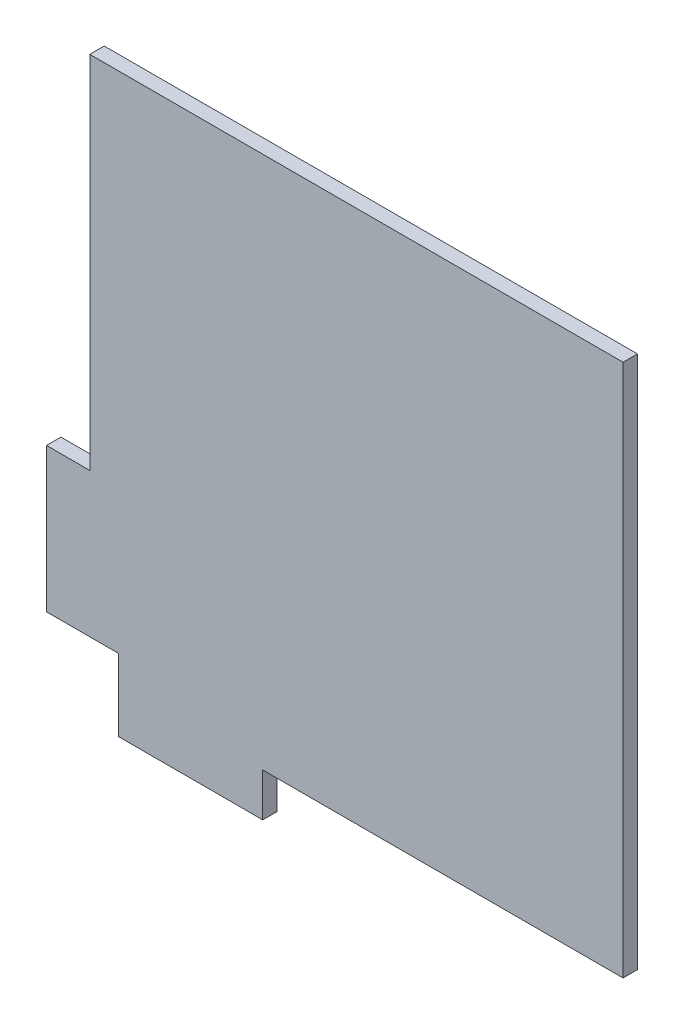
ISO-10303-21;
HEADER;
FILE_DESCRIPTION(('STEP AP214'),'2;1');
FILE_NAME('part.step','',(''),(''),'','','');
FILE_SCHEMA(('AUTOMOTIVE_DESIGN { 1 0 10303 214 1 1 1 1 }'));
ENDSEC;
DATA;
#1=APPLICATION_CONTEXT('core data for automotive mechanical design processes');
#2=APPLICATION_PROTOCOL_DEFINITION('international standard','automotive_design',2000,#1);
#3=PRODUCT_CONTEXT('',#1,'mechanical');
#4=PRODUCT('Part','Part','',(#3));
#5=PRODUCT_RELATED_PRODUCT_CATEGORY('part','',(#4));
#6=PRODUCT_DEFINITION_FORMATION('','',#4);
#7=PRODUCT_DEFINITION_CONTEXT('part definition',#1,'design');
#8=PRODUCT_DEFINITION('design','',#6,#7);
#9=PRODUCT_DEFINITION_SHAPE('','',#8);
#10=(LENGTH_UNIT() NAMED_UNIT(*) SI_UNIT(.MILLI.,.METRE.));
#11=(NAMED_UNIT(*) PLANE_ANGLE_UNIT() SI_UNIT($,.RADIAN.));
#12=(NAMED_UNIT(*) SI_UNIT($,.STERADIAN.) SOLID_ANGLE_UNIT());
#13=UNCERTAINTY_MEASURE_WITH_UNIT(LENGTH_MEASURE(1.E-05),#10,'distance_accuracy_value','');
#14=(GEOMETRIC_REPRESENTATION_CONTEXT(3) GLOBAL_UNCERTAINTY_ASSIGNED_CONTEXT((#13)) GLOBAL_UNIT_ASSIGNED_CONTEXT((#10,
#11,#12)) REPRESENTATION_CONTEXT('',''));
#15=CARTESIAN_POINT('',(0.,0.,0.));
#16=DIRECTION('',(0.,0.,1.));
#17=DIRECTION('',(1.,0.,0.));
#18=AXIS2_PLACEMENT_3D('',#15,#16,#17);
#19=CARTESIAN_POINT('',(0.,3.7,0.05));
#20=DIRECTION('',(0.,-1.,0.));
#21=DIRECTION('',(1.,0.,0.));
#22=AXIS2_PLACEMENT_3D('',#19,#20,#21);
#23=PLANE('',#22);
#24=DIRECTION('',(-1.,0.,0.));
#25=VECTOR('',#24,1.);
#26=CARTESIAN_POINT('',(0.,3.7,-0.05));
#27=LINE('',#26,#25);
#28=CARTESIAN_POINT('',(0.,3.7,-0.05));
#29=VERTEX_POINT('',#28);
#30=CARTESIAN_POINT('',(-3.7,3.7,-0.05));
#31=VERTEX_POINT('',#30);
#32=EDGE_CURVE('E152',#29,#31,#27,.T.);
#33=ORIENTED_EDGE('',*,*,#32,.T.);
#34=DIRECTION('',(0.,0.,-1.));
#35=VECTOR('',#34,1.);
#36=CARTESIAN_POINT('',(-3.7,3.7,0.05));
#37=LINE('',#36,#35);
#38=CARTESIAN_POINT('',(-3.7,3.7,0.05));
#39=VERTEX_POINT('',#38);
#40=EDGE_CURVE('E11',#39,#31,#37,.T.);
#41=ORIENTED_EDGE('',*,*,#40,.F.);
#42=DIRECTION('',(-1.,0.,0.));
#43=VECTOR('',#42,1.);
#44=CARTESIAN_POINT('',(0.,3.7,0.05));
#45=LINE('',#44,#43);
#46=CARTESIAN_POINT('',(0.,3.7,0.05));
#47=VERTEX_POINT('',#46);
#48=EDGE_CURVE('E180',#47,#39,#45,.T.);
#49=ORIENTED_EDGE('',*,*,#48,.F.);
#50=DIRECTION('',(0.,0.,-1.));
#51=VECTOR('',#50,1.);
#52=CARTESIAN_POINT('',(0.,3.7,0.05));
#53=LINE('',#52,#51);
#54=EDGE_CURVE('E148',#47,#29,#53,.T.);
#55=ORIENTED_EDGE('',*,*,#54,.T.);
#56=EDGE_LOOP('',(#33,#41,#49,#55));
#57=FACE_BOUND('',#56,.T.);
#58=ADVANCED_FACE('F39',(#57),#23,.F.);
#59=CARTESIAN_POINT('',(-3.7,1.2,0.05));
#60=DIRECTION('',(1.,0.,0.));
#61=DIRECTION('',(0.,0.,-1.));
#62=AXIS2_PLACEMENT_3D('',#59,#60,#61);
#63=PLANE('',#62);
#64=DIRECTION('',(0.,-1.,0.));
#65=VECTOR('',#64,1.);
#66=CARTESIAN_POINT('',(-3.7,1.2,-0.05));
#67=LINE('',#66,#65);
#68=CARTESIAN_POINT('',(-3.7,1.2,-0.05));
#69=VERTEX_POINT('',#68);
#70=EDGE_CURVE('E156',#31,#69,#67,.T.);
#71=ORIENTED_EDGE('',*,*,#70,.T.);
#72=DIRECTION('',(0.,0.,-1.));
#73=VECTOR('',#72,1.);
#74=CARTESIAN_POINT('',(-3.7,1.2,0.05));
#75=LINE('',#74,#73);
#76=CARTESIAN_POINT('',(-3.7,1.2,0.05));
#77=VERTEX_POINT('',#76);
#78=EDGE_CURVE('E48',#77,#69,#75,.T.);
#79=ORIENTED_EDGE('',*,*,#78,.F.);
#80=DIRECTION('',(0.,-1.,0.));
#81=VECTOR('',#80,1.);
#82=CARTESIAN_POINT('',(-3.7,1.2,0.05));
#83=LINE('',#82,#81);
#84=EDGE_CURVE('E105',#39,#77,#83,.T.);
#85=ORIENTED_EDGE('',*,*,#84,.F.);
#86=ORIENTED_EDGE('',*,*,#40,.T.);
#87=EDGE_LOOP('',(#71,#79,#85,#86));
#88=FACE_BOUND('',#87,.T.);
#89=ADVANCED_FACE('F244',(#88),#63,.F.);
#90=CARTESIAN_POINT('',(-4.,1.2,0.05));
#91=DIRECTION('',(0.,-1.,0.));
#92=DIRECTION('',(1.,0.,0.));
#93=AXIS2_PLACEMENT_3D('',#90,#91,#92);
#94=PLANE('',#93);
#95=DIRECTION('',(-1.,0.,0.));
#96=VECTOR('',#95,1.);
#97=CARTESIAN_POINT('',(-4.,1.2,-0.05));
#98=LINE('',#97,#96);
#99=CARTESIAN_POINT('',(-4.,1.2,-0.05));
#100=VERTEX_POINT('',#99);
#101=EDGE_CURVE('E159',#69,#100,#98,.T.);
#102=ORIENTED_EDGE('',*,*,#101,.T.);
#103=DIRECTION('',(0.,0.,-1.));
#104=VECTOR('',#103,1.);
#105=CARTESIAN_POINT('',(-4.,1.2,0.05));
#106=LINE('',#105,#104);
#107=CARTESIAN_POINT('',(-4.,1.2,0.05));
#108=VERTEX_POINT('',#107);
#109=EDGE_CURVE('E199',#108,#100,#106,.T.);
#110=ORIENTED_EDGE('',*,*,#109,.F.);
#111=DIRECTION('',(-1.,0.,0.));
#112=VECTOR('',#111,1.);
#113=CARTESIAN_POINT('',(-4.,1.2,0.05));
#114=LINE('',#113,#112);
#115=EDGE_CURVE('E209',#77,#108,#114,.T.);
#116=ORIENTED_EDGE('',*,*,#115,.F.);
#117=ORIENTED_EDGE('',*,*,#78,.T.);
#118=EDGE_LOOP('',(#102,#110,#116,#117));
#119=FACE_BOUND('',#118,.T.);
#120=ADVANCED_FACE('F207',(#119),#94,.F.);
#121=CARTESIAN_POINT('',(-4.,0.2,0.05));
#122=DIRECTION('',(1.,0.,0.));
#123=DIRECTION('',(0.,0.,-1.));
#124=AXIS2_PLACEMENT_3D('',#121,#122,#123);
#125=PLANE('',#124);
#126=DIRECTION('',(0.,-1.,0.));
#127=VECTOR('',#126,1.);
#128=CARTESIAN_POINT('',(-4.,0.2,-0.05));
#129=LINE('',#128,#127);
#130=CARTESIAN_POINT('',(-4.,0.2,-0.05));
#131=VERTEX_POINT('',#130);
#132=EDGE_CURVE('E162',#100,#131,#129,.T.);
#133=ORIENTED_EDGE('',*,*,#132,.T.);
#134=DIRECTION('',(0.,0.,-1.));
#135=VECTOR('',#134,1.);
#136=CARTESIAN_POINT('',(-4.,0.2,0.05));
#137=LINE('',#136,#135);
#138=CARTESIAN_POINT('',(-4.,0.2,0.05));
#139=VERTEX_POINT('',#138);
#140=EDGE_CURVE('E195',#139,#131,#137,.T.);
#141=ORIENTED_EDGE('',*,*,#140,.F.);
#142=DIRECTION('',(0.,-1.,0.));
#143=VECTOR('',#142,1.);
#144=CARTESIAN_POINT('',(-4.,0.2,0.05));
#145=LINE('',#144,#143);
#146=EDGE_CURVE('E228',#108,#139,#145,.T.);
#147=ORIENTED_EDGE('',*,*,#146,.F.);
#148=ORIENTED_EDGE('',*,*,#109,.T.);
#149=EDGE_LOOP('',(#133,#141,#147,#148));
#150=FACE_BOUND('',#149,.T.);
#151=ADVANCED_FACE('F218',(#150),#125,.F.);
#152=CARTESIAN_POINT('',(-3.5,0.2,0.05));
#153=DIRECTION('',(0.,1.,0.));
#154=DIRECTION('',(-1.,0.,0.));
#155=AXIS2_PLACEMENT_3D('',#152,#153,#154);
#156=PLANE('',#155);
#157=DIRECTION('',(1.,0.,0.));
#158=VECTOR('',#157,1.);
#159=CARTESIAN_POINT('',(-3.5,0.2,-0.05));
#160=LINE('',#159,#158);
#161=CARTESIAN_POINT('',(-3.5,0.2,-0.05));
#162=VERTEX_POINT('',#161);
#163=EDGE_CURVE('E165',#131,#162,#160,.T.);
#164=ORIENTED_EDGE('',*,*,#163,.T.);
#165=DIRECTION('',(0.,0.,-1.));
#166=VECTOR('',#165,1.);
#167=CARTESIAN_POINT('',(-3.5,0.2,0.05));
#168=LINE('',#167,#166);
#169=CARTESIAN_POINT('',(-3.5,0.2,0.05));
#170=VERTEX_POINT('',#169);
#171=EDGE_CURVE('E191',#170,#162,#168,.T.);
#172=ORIENTED_EDGE('',*,*,#171,.F.);
#173=DIRECTION('',(1.,0.,0.));
#174=VECTOR('',#173,1.);
#175=CARTESIAN_POINT('',(-3.5,0.2,0.05));
#176=LINE('',#175,#174);
#177=EDGE_CURVE('E224',#139,#170,#176,.T.);
#178=ORIENTED_EDGE('',*,*,#177,.F.);
#179=ORIENTED_EDGE('',*,*,#140,.T.);
#180=EDGE_LOOP('',(#164,#172,#178,#179));
#181=FACE_BOUND('',#180,.T.);
#182=ADVANCED_FACE('F222',(#181),#156,.F.);
#183=CARTESIAN_POINT('',(-3.5,-0.3,0.05));
#184=DIRECTION('',(1.,0.,0.));
#185=DIRECTION('',(0.,0.,-1.));
#186=AXIS2_PLACEMENT_3D('',#183,#184,#185);
#187=PLANE('',#186);
#188=DIRECTION('',(0.,-1.,0.));
#189=VECTOR('',#188,1.);
#190=CARTESIAN_POINT('',(-3.5,-0.3,-0.05));
#191=LINE('',#190,#189);
#192=CARTESIAN_POINT('',(-3.5,-0.3,-0.05));
#193=VERTEX_POINT('',#192);
#194=EDGE_CURVE('E168',#162,#193,#191,.T.);
#195=ORIENTED_EDGE('',*,*,#194,.T.);
#196=DIRECTION('',(0.,0.,-1.));
#197=VECTOR('',#196,1.);
#198=CARTESIAN_POINT('',(-3.5,-0.3,0.05));
#199=LINE('',#198,#197);
#200=CARTESIAN_POINT('',(-3.5,-0.3,0.05));
#201=VERTEX_POINT('',#200);
#202=EDGE_CURVE('E187',#201,#193,#199,.T.);
#203=ORIENTED_EDGE('',*,*,#202,.F.);
#204=DIRECTION('',(0.,-1.,0.));
#205=VECTOR('',#204,1.);
#206=CARTESIAN_POINT('',(-3.5,-0.3,0.05));
#207=LINE('',#206,#205);
#208=EDGE_CURVE('E227',#170,#201,#207,.T.);
#209=ORIENTED_EDGE('',*,*,#208,.F.);
#210=ORIENTED_EDGE('',*,*,#171,.T.);
#211=EDGE_LOOP('',(#195,#203,#209,#210));
#212=FACE_BOUND('',#211,.T.);
#213=ADVANCED_FACE('F256',(#212),#187,.F.);
#214=CARTESIAN_POINT('',(-2.5,-0.3,0.05));
#215=DIRECTION('',(0.,1.,0.));
#216=DIRECTION('',(-1.,0.,0.));
#217=AXIS2_PLACEMENT_3D('',#214,#215,#216);
#218=PLANE('',#217);
#219=DIRECTION('',(1.,0.,0.));
#220=VECTOR('',#219,1.);
#221=CARTESIAN_POINT('',(-2.5,-0.3,-0.05));
#222=LINE('',#221,#220);
#223=CARTESIAN_POINT('',(-2.5,-0.3,-0.05));
#224=VERTEX_POINT('',#223);
#225=EDGE_CURVE('E171',#193,#224,#222,.T.);
#226=ORIENTED_EDGE('',*,*,#225,.T.);
#227=DIRECTION('',(0.,0.,-1.));
#228=VECTOR('',#227,1.);
#229=CARTESIAN_POINT('',(-2.5,-0.3,0.05));
#230=LINE('',#229,#228);
#231=CARTESIAN_POINT('',(-2.5,-0.3,0.05));
#232=VERTEX_POINT('',#231);
#233=EDGE_CURVE('E141',#232,#224,#230,.T.);
#234=ORIENTED_EDGE('',*,*,#233,.F.);
#235=DIRECTION('',(1.,0.,0.));
#236=VECTOR('',#235,1.);
#237=CARTESIAN_POINT('',(-2.5,-0.3,0.05));
#238=LINE('',#237,#236);
#239=EDGE_CURVE('E130',#201,#232,#238,.T.);
#240=ORIENTED_EDGE('',*,*,#239,.F.);
#241=ORIENTED_EDGE('',*,*,#202,.T.);
#242=EDGE_LOOP('',(#226,#234,#240,#241));
#243=FACE_BOUND('',#242,.T.);
#244=ADVANCED_FACE('F259',(#243),#218,.F.);
#245=CARTESIAN_POINT('',(-2.5,0.,0.05));
#246=DIRECTION('',(-1.,0.,0.));
#247=DIRECTION('',(0.,0.,1.));
#248=AXIS2_PLACEMENT_3D('',#245,#246,#247);
#249=PLANE('',#248);
#250=DIRECTION('',(0.,1.,0.));
#251=VECTOR('',#250,1.);
#252=CARTESIAN_POINT('',(-2.5,0.,-0.05));
#253=LINE('',#252,#251);
#254=CARTESIAN_POINT('',(-2.5,0.,-0.05));
#255=VERTEX_POINT('',#254);
#256=EDGE_CURVE('E139',#224,#255,#253,.T.);
#257=ORIENTED_EDGE('',*,*,#256,.T.);
#258=DIRECTION('',(0.,0.,-1.));
#259=VECTOR('',#258,1.);
#260=CARTESIAN_POINT('',(-2.5,0.,0.05));
#261=LINE('',#260,#259);
#262=CARTESIAN_POINT('',(-2.5,0.,0.05));
#263=VERTEX_POINT('',#262);
#264=EDGE_CURVE('E136',#263,#255,#261,.T.);
#265=ORIENTED_EDGE('',*,*,#264,.F.);
#266=DIRECTION('',(0.,1.,0.));
#267=VECTOR('',#266,1.);
#268=CARTESIAN_POINT('',(-2.5,0.,0.05));
#269=LINE('',#268,#267);
#270=EDGE_CURVE('E124',#232,#263,#269,.T.);
#271=ORIENTED_EDGE('',*,*,#270,.F.);
#272=ORIENTED_EDGE('',*,*,#233,.T.);
#273=EDGE_LOOP('',(#257,#265,#271,#272));
#274=FACE_BOUND('',#273,.T.);
#275=ADVANCED_FACE('F137',(#274),#249,.F.);
#276=CARTESIAN_POINT('',(-2.5,0.,0.05));
#277=DIRECTION('',(0.,1.,0.));
#278=DIRECTION('',(0.,0.,1.));
#279=AXIS2_PLACEMENT_3D('',#276,#277,#278);
#280=PLANE('',#279);
#281=DIRECTION('',(1.,0.,0.));
#282=VECTOR('',#281,1.);
#283=CARTESIAN_POINT('',(-2.5,0.,-0.05));
#284=LINE('',#283,#282);
#285=CARTESIAN_POINT('',(0.,0.,-0.05));
#286=VERTEX_POINT('',#285);
#287=EDGE_CURVE('E91',#255,#286,#284,.T.);
#288=ORIENTED_EDGE('',*,*,#287,.T.);
#289=DIRECTION('',(0.,0.,-1.));
#290=VECTOR('',#289,1.);
#291=CARTESIAN_POINT('',(0.,0.,0.05));
#292=LINE('',#291,#290);
#293=CARTESIAN_POINT('',(0.,0.,0.05));
#294=VERTEX_POINT('',#293);
#295=EDGE_CURVE('E142',#294,#286,#292,.T.);
#296=ORIENTED_EDGE('',*,*,#295,.F.);
#297=DIRECTION('',(1.,0.,0.));
#298=VECTOR('',#297,1.);
#299=CARTESIAN_POINT('',(-2.5,0.,0.05));
#300=LINE('',#299,#298);
#301=EDGE_CURVE('E128',#263,#294,#300,.T.);
#302=ORIENTED_EDGE('',*,*,#301,.F.);
#303=ORIENTED_EDGE('',*,*,#264,.T.);
#304=EDGE_LOOP('',(#288,#296,#302,#303));
#305=FACE_BOUND('',#304,.T.);
#306=ADVANCED_FACE('F144',(#305),#280,.F.);
#307=CARTESIAN_POINT('',(0.,0.,0.05));
#308=DIRECTION('',(-1.,0.,0.));
#309=DIRECTION('',(0.,0.,1.));
#310=AXIS2_PLACEMENT_3D('',#307,#308,#309);
#311=PLANE('',#310);
#312=DIRECTION('',(0.,1.,0.));
#313=VECTOR('',#312,1.);
#314=CARTESIAN_POINT('',(0.,0.,-0.05));
#315=LINE('',#314,#313);
#316=EDGE_CURVE('E97',#286,#29,#315,.T.);
#317=ORIENTED_EDGE('',*,*,#316,.T.);
#318=ORIENTED_EDGE('',*,*,#54,.F.);
#319=DIRECTION('',(0.,1.,0.));
#320=VECTOR('',#319,1.);
#321=CARTESIAN_POINT('',(0.,0.,0.05));
#322=LINE('',#321,#320);
#323=EDGE_CURVE('E56',#294,#47,#322,.T.);
#324=ORIENTED_EDGE('',*,*,#323,.F.);
#325=ORIENTED_EDGE('',*,*,#295,.T.);
#326=EDGE_LOOP('',(#317,#318,#324,#325));
#327=FACE_BOUND('',#326,.T.);
#328=ADVANCED_FACE('F268',(#327),#311,.F.);
#329=CARTESIAN_POINT('',(0.,0.,0.05));
#330=DIRECTION('',(0.,0.,-1.));
#331=DIRECTION('',(-1.,0.,0.));
#332=AXIS2_PLACEMENT_3D('',#329,#330,#331);
#333=PLANE('',#332);
#334=ORIENTED_EDGE('',*,*,#48,.T.);
#335=ORIENTED_EDGE('',*,*,#84,.T.);
#336=ORIENTED_EDGE('',*,*,#115,.T.);
#337=ORIENTED_EDGE('',*,*,#146,.T.);
#338=ORIENTED_EDGE('',*,*,#177,.T.);
#339=ORIENTED_EDGE('',*,*,#208,.T.);
#340=ORIENTED_EDGE('',*,*,#239,.T.);
#341=ORIENTED_EDGE('',*,*,#270,.T.);
#342=ORIENTED_EDGE('',*,*,#301,.T.);
#343=ORIENTED_EDGE('',*,*,#323,.T.);
#344=EDGE_LOOP('',(#334,#335,#336,#337,#338,#339,#340,#341,#342,#343));
#345=FACE_BOUND('',#344,.T.);
#346=ADVANCED_FACE('F126',(#345),#333,.F.);
#347=CARTESIAN_POINT('',(0.,0.,-0.05));
#348=DIRECTION('',(0.,0.,-1.));
#349=DIRECTION('',(-1.,0.,0.));
#350=AXIS2_PLACEMENT_3D('',#347,#348,#349);
#351=PLANE('',#350);
#352=ORIENTED_EDGE('',*,*,#32,.F.);
#353=ORIENTED_EDGE('',*,*,#316,.F.);
#354=ORIENTED_EDGE('',*,*,#287,.F.);
#355=ORIENTED_EDGE('',*,*,#256,.F.);
#356=ORIENTED_EDGE('',*,*,#225,.F.);
#357=ORIENTED_EDGE('',*,*,#194,.F.);
#358=ORIENTED_EDGE('',*,*,#163,.F.);
#359=ORIENTED_EDGE('',*,*,#132,.F.);
#360=ORIENTED_EDGE('',*,*,#101,.F.);
#361=ORIENTED_EDGE('',*,*,#70,.F.);
#362=EDGE_LOOP('',(#352,#353,#354,#355,#356,#357,#358,#359,#360,#361));
#363=FACE_BOUND('',#362,.T.);
#364=ADVANCED_FACE('F213',(#363),#351,.T.);
#365=CLOSED_SHELL('',(#58,#89,#120,#151,#182,#213,#244,#275,#306,#328,#346,#364));
#366=MANIFOLD_SOLID_BREP('B2',#365);
#367=ADVANCED_BREP_SHAPE_REPRESENTATION('',(#18,#366),#14);
#368=SHAPE_DEFINITION_REPRESENTATION(#9,#367);
ENDSEC;
END-ISO-10303-21;
